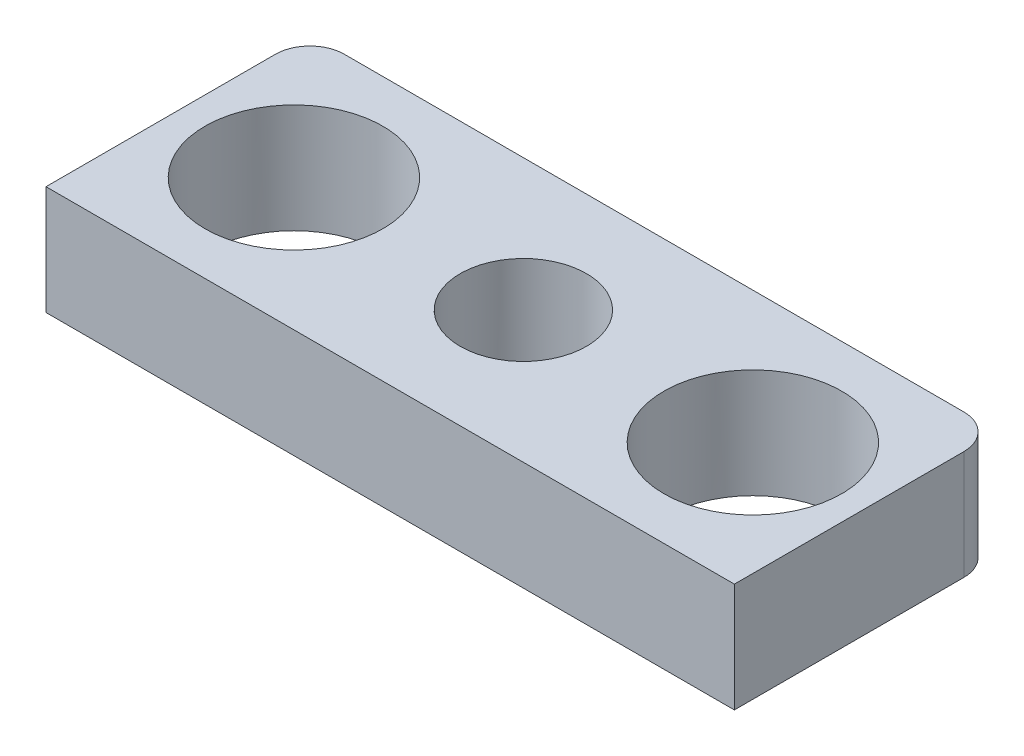
ISO-10303-21;
HEADER;
FILE_DESCRIPTION(('STEP AP214'),'2;1');
FILE_NAME('part.step','',(''),(''),'','','');
FILE_SCHEMA(('AUTOMOTIVE_DESIGN { 1 0 10303 214 1 1 1 1 }'));
ENDSEC;
DATA;
#1=APPLICATION_CONTEXT('core data for automotive mechanical design processes');
#2=APPLICATION_PROTOCOL_DEFINITION('international standard','automotive_design',2000,#1);
#3=PRODUCT_CONTEXT('',#1,'mechanical');
#4=PRODUCT('Part','Part','',(#3));
#5=PRODUCT_RELATED_PRODUCT_CATEGORY('part','',(#4));
#6=PRODUCT_DEFINITION_FORMATION('','',#4);
#7=PRODUCT_DEFINITION_CONTEXT('part definition',#1,'design');
#8=PRODUCT_DEFINITION('design','',#6,#7);
#9=PRODUCT_DEFINITION_SHAPE('','',#8);
#10=(LENGTH_UNIT() NAMED_UNIT(*) SI_UNIT(.MILLI.,.METRE.));
#11=(NAMED_UNIT(*) PLANE_ANGLE_UNIT() SI_UNIT($,.RADIAN.));
#12=(NAMED_UNIT(*) SI_UNIT($,.STERADIAN.) SOLID_ANGLE_UNIT());
#13=UNCERTAINTY_MEASURE_WITH_UNIT(LENGTH_MEASURE(1.E-05),#10,'distance_accuracy_value','');
#14=(GEOMETRIC_REPRESENTATION_CONTEXT(3) GLOBAL_UNCERTAINTY_ASSIGNED_CONTEXT((#13)) GLOBAL_UNIT_ASSIGNED_CONTEXT((#10,
#11,#12)) REPRESENTATION_CONTEXT('',''));
#15=CARTESIAN_POINT('',(0.,0.,0.));
#16=DIRECTION('',(0.,0.,1.));
#17=DIRECTION('',(1.,0.,0.));
#18=AXIS2_PLACEMENT_3D('',#15,#16,#17);
#19=CARTESIAN_POINT('',(30.,9.5,-23.));
#20=DIRECTION('',(-1.,0.,0.));
#21=DIRECTION('',(0.,0.,1.));
#22=AXIS2_PLACEMENT_3D('',#19,#20,#21);
#23=PLANE('',#22);
#24=DIRECTION('',(0.,0.,-1.));
#25=VECTOR('',#24,1.);
#26=CARTESIAN_POINT('',(30.,0.,-23.));
#27=LINE('',#26,#25);
#28=CARTESIAN_POINT('',(30.,0.,0.));
#29=VERTEX_POINT('',#28);
#30=CARTESIAN_POINT('',(30.,0.,-20.));
#31=VERTEX_POINT('',#30);
#32=EDGE_CURVE('E177',#29,#31,#27,.T.);
#33=ORIENTED_EDGE('',*,*,#32,.T.);
#34=DIRECTION('',(0.,-1.,0.));
#35=VECTOR('',#34,1.);
#36=CARTESIAN_POINT('',(30.,9.5,-20.));
#37=LINE('',#36,#35);
#38=CARTESIAN_POINT('',(30.,9.5,-20.));
#39=VERTEX_POINT('',#38);
#40=EDGE_CURVE('E121',#31,#39,#37,.F.);
#41=ORIENTED_EDGE('',*,*,#40,.T.);
#42=DIRECTION('',(0.,0.,-1.));
#43=VECTOR('',#42,1.);
#44=CARTESIAN_POINT('',(30.,9.5,-23.));
#45=LINE('',#44,#43);
#46=CARTESIAN_POINT('',(30.,9.5,0.));
#47=VERTEX_POINT('',#46);
#48=EDGE_CURVE('E115',#47,#39,#45,.T.);
#49=ORIENTED_EDGE('',*,*,#48,.F.);
#50=DIRECTION('',(0.,-1.,0.));
#51=VECTOR('',#50,1.);
#52=CARTESIAN_POINT('',(30.,9.5,0.));
#53=LINE('',#52,#51);
#54=EDGE_CURVE('E119',#47,#29,#53,.T.);
#55=ORIENTED_EDGE('',*,*,#54,.T.);
#56=EDGE_LOOP('',(#33,#41,#49,#55));
#57=FACE_BOUND('',#56,.T.);
#58=ADVANCED_FACE('F35',(#57),#23,.F.);
#59=CARTESIAN_POINT('',(14.,9.5,-23.));
#60=DIRECTION('',(0.,0.,1.));
#61=DIRECTION('',(1.,0.,0.));
#62=AXIS2_PLACEMENT_3D('',#59,#60,#61);
#63=PLANE('',#62);
#64=DIRECTION('',(-1.,0.,0.));
#65=VECTOR('',#64,1.);
#66=CARTESIAN_POINT('',(14.,9.5,-23.));
#67=LINE('',#66,#65);
#68=CARTESIAN_POINT('',(27.,9.5,-23.));
#69=VERTEX_POINT('',#68);
#70=CARTESIAN_POINT('',(14.,9.5,-23.));
#71=VERTEX_POINT('',#70);
#72=EDGE_CURVE('E123',#69,#71,#67,.T.);
#73=ORIENTED_EDGE('',*,*,#72,.F.);
#74=DIRECTION('',(0.,-1.,0.));
#75=VECTOR('',#74,1.);
#76=CARTESIAN_POINT('',(27.,9.5,-23.));
#77=LINE('',#76,#75);
#78=CARTESIAN_POINT('',(27.,0.,-23.));
#79=VERTEX_POINT('',#78);
#80=EDGE_CURVE('E137',#69,#79,#77,.T.);
#81=ORIENTED_EDGE('',*,*,#80,.T.);
#82=DIRECTION('',(-1.,0.,0.));
#83=VECTOR('',#82,1.);
#84=CARTESIAN_POINT('',(14.,0.,-23.));
#85=LINE('',#84,#83);
#86=CARTESIAN_POINT('',(14.,0.,-23.));
#87=VERTEX_POINT('',#86);
#88=EDGE_CURVE('E180',#79,#87,#85,.T.);
#89=ORIENTED_EDGE('',*,*,#88,.T.);
#90=DIRECTION('',(0.,-1.,0.));
#91=VECTOR('',#90,1.);
#92=CARTESIAN_POINT('',(14.,9.5,-23.));
#93=LINE('',#92,#91);
#94=EDGE_CURVE('E138',#71,#87,#93,.T.);
#95=ORIENTED_EDGE('',*,*,#94,.F.);
#96=EDGE_LOOP('',(#73,#81,#89,#95));
#97=FACE_BOUND('',#96,.T.);
#98=ADVANCED_FACE('F247',(#97),#63,.F.);
#99=CARTESIAN_POINT('',(-14.,9.5,-22.9970777992595));
#100=DIRECTION('',(0.,0.,1.));
#101=DIRECTION('',(1.,0.,0.));
#102=AXIS2_PLACEMENT_3D('',#99,#100,#101);
#103=PLANE('',#102);
#104=DIRECTION('',(-1.,0.,0.));
#105=VECTOR('',#104,1.);
#106=CARTESIAN_POINT('',(-14.,9.5,-22.9970777992595));
#107=LINE('',#106,#105);
#108=CARTESIAN_POINT('',(13.8676192416318,9.5,-22.9970777992595));
#109=VERTEX_POINT('',#108);
#110=CARTESIAN_POINT('',(-13.8676192416319,9.5,-22.9970777992595));
#111=VERTEX_POINT('',#110);
#112=EDGE_CURVE('E212',#109,#111,#107,.T.);
#113=ORIENTED_EDGE('',*,*,#112,.F.);
#114=DIRECTION('',(0.,-1.,0.));
#115=VECTOR('',#114,1.);
#116=CARTESIAN_POINT('',(13.8676192416318,9.5,-22.9970777992595));
#117=LINE('',#116,#115);
#118=CARTESIAN_POINT('',(13.8676192416318,0.,-22.9970777992595));
#119=VERTEX_POINT('',#118);
#120=EDGE_CURVE('E157',#109,#119,#117,.T.);
#121=ORIENTED_EDGE('',*,*,#120,.T.);
#122=DIRECTION('',(-1.,0.,0.));
#123=VECTOR('',#122,1.);
#124=CARTESIAN_POINT('',(-14.,0.,-22.9970777992595));
#125=LINE('',#124,#123);
#126=CARTESIAN_POINT('',(-13.8676192416319,0.,-22.9970777992595));
#127=VERTEX_POINT('',#126);
#128=EDGE_CURVE('E183',#119,#127,#125,.T.);
#129=ORIENTED_EDGE('',*,*,#128,.T.);
#130=DIRECTION('',(0.,1.,0.));
#131=VECTOR('',#130,1.);
#132=CARTESIAN_POINT('',(-13.8676192416319,9.5,-22.9970777992595));
#133=LINE('',#132,#131);
#134=EDGE_CURVE('E155',#127,#111,#133,.T.);
#135=ORIENTED_EDGE('',*,*,#134,.T.);
#136=EDGE_LOOP('',(#113,#121,#129,#135));
#137=FACE_BOUND('',#136,.T.);
#138=ADVANCED_FACE('F252',(#137),#103,.F.);
#139=CARTESIAN_POINT('',(-30.,9.5,-23.));
#140=DIRECTION('',(0.,0.,1.));
#141=DIRECTION('',(1.,0.,0.));
#142=AXIS2_PLACEMENT_3D('',#139,#140,#141);
#143=PLANE('',#142);
#144=DIRECTION('',(-1.,0.,0.));
#145=VECTOR('',#144,1.);
#146=CARTESIAN_POINT('',(-30.,0.,-23.));
#147=LINE('',#146,#145);
#148=CARTESIAN_POINT('',(-14.,0.,-23.));
#149=VERTEX_POINT('',#148);
#150=CARTESIAN_POINT('',(-27.,0.,-23.));
#151=VERTEX_POINT('',#150);
#152=EDGE_CURVE('E190',#149,#151,#147,.T.);
#153=ORIENTED_EDGE('',*,*,#152,.T.);
#154=DIRECTION('',(0.,-1.,0.));
#155=VECTOR('',#154,1.);
#156=CARTESIAN_POINT('',(-27.,9.5,-23.));
#157=LINE('',#156,#155);
#158=CARTESIAN_POINT('',(-27.,9.5,-23.));
#159=VERTEX_POINT('',#158);
#160=EDGE_CURVE('E60',#151,#159,#157,.F.);
#161=ORIENTED_EDGE('',*,*,#160,.T.);
#162=DIRECTION('',(-1.,0.,0.));
#163=VECTOR('',#162,1.);
#164=CARTESIAN_POINT('',(-30.,9.5,-23.));
#165=LINE('',#164,#163);
#166=CARTESIAN_POINT('',(-14.,9.5,-23.));
#167=VERTEX_POINT('',#166);
#168=EDGE_CURVE('E200',#167,#159,#165,.T.);
#169=ORIENTED_EDGE('',*,*,#168,.F.);
#170=DIRECTION('',(0.,-1.,0.));
#171=VECTOR('',#170,1.);
#172=CARTESIAN_POINT('',(-14.,9.5,-23.));
#173=LINE('',#172,#171);
#174=EDGE_CURVE('E144',#167,#149,#173,.T.);
#175=ORIENTED_EDGE('',*,*,#174,.T.);
#176=EDGE_LOOP('',(#153,#161,#169,#175));
#177=FACE_BOUND('',#176,.T.);
#178=ADVANCED_FACE('F199',(#177),#143,.F.);
#179=CARTESIAN_POINT('',(-30.,9.5,0.));
#180=DIRECTION('',(1.,0.,0.));
#181=DIRECTION('',(0.,0.,-1.));
#182=AXIS2_PLACEMENT_3D('',#179,#180,#181);
#183=PLANE('',#182);
#184=DIRECTION('',(0.,0.,1.));
#185=VECTOR('',#184,1.);
#186=CARTESIAN_POINT('',(-30.,9.5,0.));
#187=LINE('',#186,#185);
#188=CARTESIAN_POINT('',(-30.,9.5,-20.));
#189=VERTEX_POINT('',#188);
#190=CARTESIAN_POINT('',(-30.,9.5,0.));
#191=VERTEX_POINT('',#190);
#192=EDGE_CURVE('E128',#189,#191,#187,.T.);
#193=ORIENTED_EDGE('',*,*,#192,.F.);
#194=DIRECTION('',(0.,-1.,0.));
#195=VECTOR('',#194,1.);
#196=CARTESIAN_POINT('',(-30.,9.5,-20.));
#197=LINE('',#196,#195);
#198=CARTESIAN_POINT('',(-30.,0.,-20.));
#199=VERTEX_POINT('',#198);
#200=EDGE_CURVE('E160',#189,#199,#197,.T.);
#201=ORIENTED_EDGE('',*,*,#200,.T.);
#202=DIRECTION('',(0.,0.,1.));
#203=VECTOR('',#202,1.);
#204=CARTESIAN_POINT('',(-30.,0.,0.));
#205=LINE('',#204,#203);
#206=CARTESIAN_POINT('',(-30.,0.,0.));
#207=VERTEX_POINT('',#206);
#208=EDGE_CURVE('E192',#199,#207,#205,.T.);
#209=ORIENTED_EDGE('',*,*,#208,.T.);
#210=DIRECTION('',(0.,-1.,0.));
#211=VECTOR('',#210,1.);
#212=CARTESIAN_POINT('',(-30.,9.5,0.));
#213=LINE('',#212,#211);
#214=EDGE_CURVE('E195',#191,#207,#213,.T.);
#215=ORIENTED_EDGE('',*,*,#214,.F.);
#216=EDGE_LOOP('',(#193,#201,#209,#215));
#217=FACE_BOUND('',#216,.T.);
#218=ADVANCED_FACE('F211',(#217),#183,.F.);
#219=CARTESIAN_POINT('',(0.,9.5,0.));
#220=DIRECTION('',(0.,0.,-1.));
#221=DIRECTION('',(-1.,0.,0.));
#222=AXIS2_PLACEMENT_3D('',#219,#220,#221);
#223=PLANE('',#222);
#224=DIRECTION('',(1.,0.,0.));
#225=VECTOR('',#224,1.);
#226=CARTESIAN_POINT('',(0.,0.,0.));
#227=LINE('',#226,#225);
#228=EDGE_CURVE('E132',#207,#29,#227,.T.);
#229=ORIENTED_EDGE('',*,*,#228,.T.);
#230=ORIENTED_EDGE('',*,*,#54,.F.);
#231=DIRECTION('',(1.,0.,0.));
#232=VECTOR('',#231,1.);
#233=CARTESIAN_POINT('',(30.,9.5,0.));
#234=LINE('',#233,#232);
#235=EDGE_CURVE('E124',#191,#47,#234,.T.);
#236=ORIENTED_EDGE('',*,*,#235,.F.);
#237=ORIENTED_EDGE('',*,*,#214,.T.);
#238=EDGE_LOOP('',(#229,#230,#236,#237));
#239=FACE_BOUND('',#238,.T.);
#240=ADVANCED_FACE('F134',(#239),#223,.F.);
#241=CARTESIAN_POINT('',(0.,9.5,0.));
#242=DIRECTION('',(0.,-1.,0.));
#243=DIRECTION('',(0.,0.,-1.));
#244=AXIS2_PLACEMENT_3D('',#241,#242,#243);
#245=PLANE('',#244);
#246=CARTESIAN_POINT('',(20.1101651298677,9.5,-11.5));
#247=DIRECTION('',(0.,1.,0.));
#248=DIRECTION('',(0.,0.,1.));
#249=AXIS2_PLACEMENT_3D('',#246,#247,#248);
#250=CIRCLE('',#249,7.75);
#251=CARTESIAN_POINT('',(20.1101651298677,9.5,-3.74999999999999));
#252=VERTEX_POINT('',#251);
#253=EDGE_CURVE('E172',#252,#252,#250,.T.);
#254=ORIENTED_EDGE('',*,*,#253,.F.);
#255=EDGE_LOOP('',(#254));
#256=FACE_BOUND('',#255,.T.);
#257=CARTESIAN_POINT('',(-19.8898348701323,9.5,-11.5));
#258=DIRECTION('',(0.,1.,0.));
#259=DIRECTION('',(0.,0.,1.));
#260=AXIS2_PLACEMENT_3D('',#257,#258,#259);
#261=CIRCLE('',#260,7.75);
#262=CARTESIAN_POINT('',(-19.8898348701323,9.5,-3.74999999999999));
#263=VERTEX_POINT('',#262);
#264=EDGE_CURVE('E220',#263,#263,#261,.T.);
#265=ORIENTED_EDGE('',*,*,#264,.F.);
#266=EDGE_LOOP('',(#265));
#267=FACE_BOUND('',#266,.T.);
#268=CARTESIAN_POINT('',(0.110165129867724,9.5,-11.4970777992595));
#269=DIRECTION('',(0.,1.,0.));
#270=DIRECTION('',(0.,0.,1.));
#271=AXIS2_PLACEMENT_3D('',#268,#269,#270);
#272=CIRCLE('',#271,5.5);
#273=CARTESIAN_POINT('',(0.110165129867724,9.5,-5.99707779925945));
#274=VERTEX_POINT('',#273);
#275=EDGE_CURVE('E217',#274,#274,#272,.T.);
#276=ORIENTED_EDGE('',*,*,#275,.F.);
#277=EDGE_LOOP('',(#276));
#278=FACE_BOUND('',#277,.T.);
#279=ORIENTED_EDGE('',*,*,#48,.T.);
#280=CARTESIAN_POINT('',(27.,9.5,-20.));
#281=DIRECTION('',(0.,-1.,0.));
#282=DIRECTION('',(0.,0.,-1.));
#283=AXIS2_PLACEMENT_3D('',#280,#281,#282);
#284=CIRCLE('',#283,3.);
#285=EDGE_CURVE('E153',#39,#69,#284,.F.);
#286=ORIENTED_EDGE('',*,*,#285,.T.);
#287=ORIENTED_EDGE('',*,*,#72,.T.);
#288=CARTESIAN_POINT('',(13.8676192416318,9.5,-25.9970777992595));
#289=DIRECTION('',(0.,-1.,0.));
#290=DIRECTION('',(0.,0.,-1.));
#291=AXIS2_PLACEMENT_3D('',#288,#289,#290);
#292=CIRCLE('',#291,3.);
#293=EDGE_CURVE('E166',#71,#109,#292,.T.);
#294=ORIENTED_EDGE('',*,*,#293,.T.);
#295=ORIENTED_EDGE('',*,*,#112,.T.);
#296=CARTESIAN_POINT('',(-13.8676192416319,9.5,-25.9970777992595));
#297=DIRECTION('',(0.,-1.,0.));
#298=DIRECTION('',(0.,0.,-1.));
#299=AXIS2_PLACEMENT_3D('',#296,#297,#298);
#300=CIRCLE('',#299,3.);
#301=EDGE_CURVE('E11',#111,#167,#300,.T.);
#302=ORIENTED_EDGE('',*,*,#301,.T.);
#303=ORIENTED_EDGE('',*,*,#168,.T.);
#304=CARTESIAN_POINT('',(-27.,9.5,-20.));
#305=DIRECTION('',(0.,-1.,0.));
#306=DIRECTION('',(0.,0.,-1.));
#307=AXIS2_PLACEMENT_3D('',#304,#305,#306);
#308=CIRCLE('',#307,3.);
#309=EDGE_CURVE('E52',#159,#189,#308,.F.);
#310=ORIENTED_EDGE('',*,*,#309,.T.);
#311=ORIENTED_EDGE('',*,*,#192,.T.);
#312=ORIENTED_EDGE('',*,*,#235,.T.);
#313=EDGE_LOOP('',(#279,#286,#287,#294,#295,#302,#303,#310,#311,#312));
#314=FACE_BOUND('',#313,.T.);
#315=ADVANCED_FACE('F127',(#256,#267,#278,#314),#245,.F.);
#316=CARTESIAN_POINT('',(0.,0.,0.));
#317=DIRECTION('',(0.,-1.,0.));
#318=DIRECTION('',(0.,0.,-1.));
#319=AXIS2_PLACEMENT_3D('',#316,#317,#318);
#320=PLANE('',#319);
#321=CARTESIAN_POINT('',(20.1101651298677,0.,-11.5));
#322=DIRECTION('',(0.,-1.,0.));
#323=DIRECTION('',(0.,0.,-1.));
#324=AXIS2_PLACEMENT_3D('',#321,#322,#323);
#325=CIRCLE('',#324,7.75);
#326=CARTESIAN_POINT('',(20.1101651298677,0.,-19.25));
#327=VERTEX_POINT('',#326);
#328=EDGE_CURVE('E39',#327,#327,#325,.T.);
#329=ORIENTED_EDGE('',*,*,#328,.F.);
#330=EDGE_LOOP('',(#329));
#331=FACE_BOUND('',#330,.T.);
#332=CARTESIAN_POINT('',(-19.8898348701323,0.,-11.5));
#333=DIRECTION('',(0.,-1.,0.));
#334=DIRECTION('',(0.,0.,-1.));
#335=AXIS2_PLACEMENT_3D('',#332,#333,#334);
#336=CIRCLE('',#335,7.75);
#337=CARTESIAN_POINT('',(-19.8898348701323,0.,-19.25));
#338=VERTEX_POINT('',#337);
#339=EDGE_CURVE('E171',#338,#338,#336,.T.);
#340=ORIENTED_EDGE('',*,*,#339,.F.);
#341=EDGE_LOOP('',(#340));
#342=FACE_BOUND('',#341,.T.);
#343=CARTESIAN_POINT('',(0.110165129867724,0.,-11.4970777992595));
#344=DIRECTION('',(0.,-1.,0.));
#345=DIRECTION('',(0.,0.,-1.));
#346=AXIS2_PLACEMENT_3D('',#343,#344,#345);
#347=CIRCLE('',#346,5.5);
#348=CARTESIAN_POINT('',(0.110165129867724,0.,-16.9970777992595));
#349=VERTEX_POINT('',#348);
#350=EDGE_CURVE('E169',#349,#349,#347,.T.);
#351=ORIENTED_EDGE('',*,*,#350,.F.);
#352=EDGE_LOOP('',(#351));
#353=FACE_BOUND('',#352,.T.);
#354=ORIENTED_EDGE('',*,*,#88,.F.);
#355=CARTESIAN_POINT('',(27.,0.,-20.));
#356=DIRECTION('',(0.,-1.,0.));
#357=DIRECTION('',(0.,0.,-1.));
#358=AXIS2_PLACEMENT_3D('',#355,#356,#357);
#359=CIRCLE('',#358,3.);
#360=EDGE_CURVE('E149',#79,#31,#359,.T.);
#361=ORIENTED_EDGE('',*,*,#360,.T.);
#362=ORIENTED_EDGE('',*,*,#32,.F.);
#363=ORIENTED_EDGE('',*,*,#228,.F.);
#364=ORIENTED_EDGE('',*,*,#208,.F.);
#365=CARTESIAN_POINT('',(-27.,0.,-20.));
#366=DIRECTION('',(0.,-1.,0.));
#367=DIRECTION('',(0.,0.,-1.));
#368=AXIS2_PLACEMENT_3D('',#365,#366,#367);
#369=CIRCLE('',#368,3.);
#370=EDGE_CURVE('E141',#199,#151,#369,.T.);
#371=ORIENTED_EDGE('',*,*,#370,.T.);
#372=ORIENTED_EDGE('',*,*,#152,.F.);
#373=CARTESIAN_POINT('',(-13.8676192416319,0.,-25.9970777992595));
#374=DIRECTION('',(0.,-1.,0.));
#375=DIRECTION('',(0.,0.,-1.));
#376=AXIS2_PLACEMENT_3D('',#373,#374,#375);
#377=CIRCLE('',#376,3.);
#378=EDGE_CURVE('E44',#149,#127,#377,.F.);
#379=ORIENTED_EDGE('',*,*,#378,.T.);
#380=ORIENTED_EDGE('',*,*,#128,.F.);
#381=CARTESIAN_POINT('',(13.8676192416318,0.,-25.9970777992595));
#382=DIRECTION('',(0.,-1.,0.));
#383=DIRECTION('',(0.,0.,-1.));
#384=AXIS2_PLACEMENT_3D('',#381,#382,#383);
#385=CIRCLE('',#384,3.);
#386=EDGE_CURVE('E164',#119,#87,#385,.F.);
#387=ORIENTED_EDGE('',*,*,#386,.T.);
#388=EDGE_LOOP('',(#354,#361,#362,#363,#364,#371,#372,#379,#380,#387));
#389=FACE_BOUND('',#388,.T.);
#390=ADVANCED_FACE('F205',(#331,#342,#353,#389),#320,.T.);
#391=CARTESIAN_POINT('',(27.,9.5,-20.));
#392=DIRECTION('',(0.,-1.,0.));
#393=DIRECTION('',(0.,0.,-1.));
#394=AXIS2_PLACEMENT_3D('',#391,#392,#393);
#395=CYLINDRICAL_SURFACE('',#394,3.);
#396=ORIENTED_EDGE('',*,*,#285,.F.);
#397=ORIENTED_EDGE('',*,*,#40,.F.);
#398=ORIENTED_EDGE('',*,*,#360,.F.);
#399=ORIENTED_EDGE('',*,*,#80,.F.);
#400=EDGE_LOOP('',(#396,#397,#398,#399));
#401=FACE_BOUND('',#400,.T.);
#402=ADVANCED_FACE('F257',(#401),#395,.T.);
#403=CARTESIAN_POINT('',(13.8676192416318,9.5,-25.9970777992595));
#404=DIRECTION('',(0.,-1.,0.));
#405=DIRECTION('',(0.,0.,-1.));
#406=AXIS2_PLACEMENT_3D('',#403,#404,#405);
#407=CYLINDRICAL_SURFACE('',#406,3.);
#408=ORIENTED_EDGE('',*,*,#293,.F.);
#409=ORIENTED_EDGE('',*,*,#94,.T.);
#410=ORIENTED_EDGE('',*,*,#386,.F.);
#411=ORIENTED_EDGE('',*,*,#120,.F.);
#412=EDGE_LOOP('',(#408,#409,#410,#411));
#413=FACE_BOUND('',#412,.T.);
#414=ADVANCED_FACE('F260',(#413),#407,.F.);
#415=CARTESIAN_POINT('',(-13.8676192416319,9.5,-25.9970777992595));
#416=DIRECTION('',(0.,1.,0.));
#417=DIRECTION('',(0.,0.,1.));
#418=AXIS2_PLACEMENT_3D('',#415,#416,#417);
#419=CYLINDRICAL_SURFACE('',#418,3.);
#420=ORIENTED_EDGE('',*,*,#301,.F.);
#421=ORIENTED_EDGE('',*,*,#134,.F.);
#422=ORIENTED_EDGE('',*,*,#378,.F.);
#423=ORIENTED_EDGE('',*,*,#174,.F.);
#424=EDGE_LOOP('',(#420,#421,#422,#423));
#425=FACE_BOUND('',#424,.T.);
#426=ADVANCED_FACE('F245',(#425),#419,.F.);
#427=CARTESIAN_POINT('',(-27.,9.5,-20.));
#428=DIRECTION('',(0.,-1.,0.));
#429=DIRECTION('',(0.,0.,-1.));
#430=AXIS2_PLACEMENT_3D('',#427,#428,#429);
#431=CYLINDRICAL_SURFACE('',#430,3.);
#432=ORIENTED_EDGE('',*,*,#309,.F.);
#433=ORIENTED_EDGE('',*,*,#160,.F.);
#434=ORIENTED_EDGE('',*,*,#370,.F.);
#435=ORIENTED_EDGE('',*,*,#200,.F.);
#436=EDGE_LOOP('',(#432,#433,#434,#435));
#437=FACE_BOUND('',#436,.T.);
#438=ADVANCED_FACE('F37',(#437),#431,.T.);
#439=CARTESIAN_POINT('',(0.110165129867724,-0.5,-11.4970777992595));
#440=DIRECTION('',(0.,1.,0.));
#441=DIRECTION('',(0.,0.,1.));
#442=AXIS2_PLACEMENT_3D('',#439,#440,#441);
#443=CYLINDRICAL_SURFACE('',#442,5.5);
#444=ORIENTED_EDGE('',*,*,#350,.T.);
#445=EDGE_LOOP('',(#444));
#446=FACE_BOUND('',#445,.T.);
#447=ORIENTED_EDGE('',*,*,#275,.T.);
#448=EDGE_LOOP('',(#447));
#449=FACE_BOUND('',#448,.T.);
#450=ADVANCED_FACE('F235',(#446,#449),#443,.F.);
#451=CARTESIAN_POINT('',(-19.8898348701323,-0.5,-11.5));
#452=DIRECTION('',(0.,1.,0.));
#453=DIRECTION('',(0.,0.,1.));
#454=AXIS2_PLACEMENT_3D('',#451,#452,#453);
#455=CYLINDRICAL_SURFACE('',#454,7.75);
#456=ORIENTED_EDGE('',*,*,#339,.T.);
#457=EDGE_LOOP('',(#456));
#458=FACE_BOUND('',#457,.T.);
#459=ORIENTED_EDGE('',*,*,#264,.T.);
#460=EDGE_LOOP('',(#459));
#461=FACE_BOUND('',#460,.T.);
#462=ADVANCED_FACE('F237',(#458,#461),#455,.F.);
#463=CARTESIAN_POINT('',(20.1101651298677,-0.5,-11.5));
#464=DIRECTION('',(0.,1.,0.));
#465=DIRECTION('',(0.,0.,1.));
#466=AXIS2_PLACEMENT_3D('',#463,#464,#465);
#467=CYLINDRICAL_SURFACE('',#466,7.75);
#468=ORIENTED_EDGE('',*,*,#328,.T.);
#469=EDGE_LOOP('',(#468));
#470=FACE_BOUND('',#469,.T.);
#471=ORIENTED_EDGE('',*,*,#253,.T.);
#472=EDGE_LOOP('',(#471));
#473=FACE_BOUND('',#472,.T.);
#474=ADVANCED_FACE('F226',(#470,#473),#467,.F.);
#475=CLOSED_SHELL('',(#58,#98,#138,#178,#218,#240,#315,#390,#402,#414,#426,#438,#450,#462,#474));
#476=MANIFOLD_SOLID_BREP('B2',#475);
#477=ADVANCED_BREP_SHAPE_REPRESENTATION('',(#18,#476),#14);
#478=SHAPE_DEFINITION_REPRESENTATION(#9,#477);
ENDSEC;
END-ISO-10303-21;
